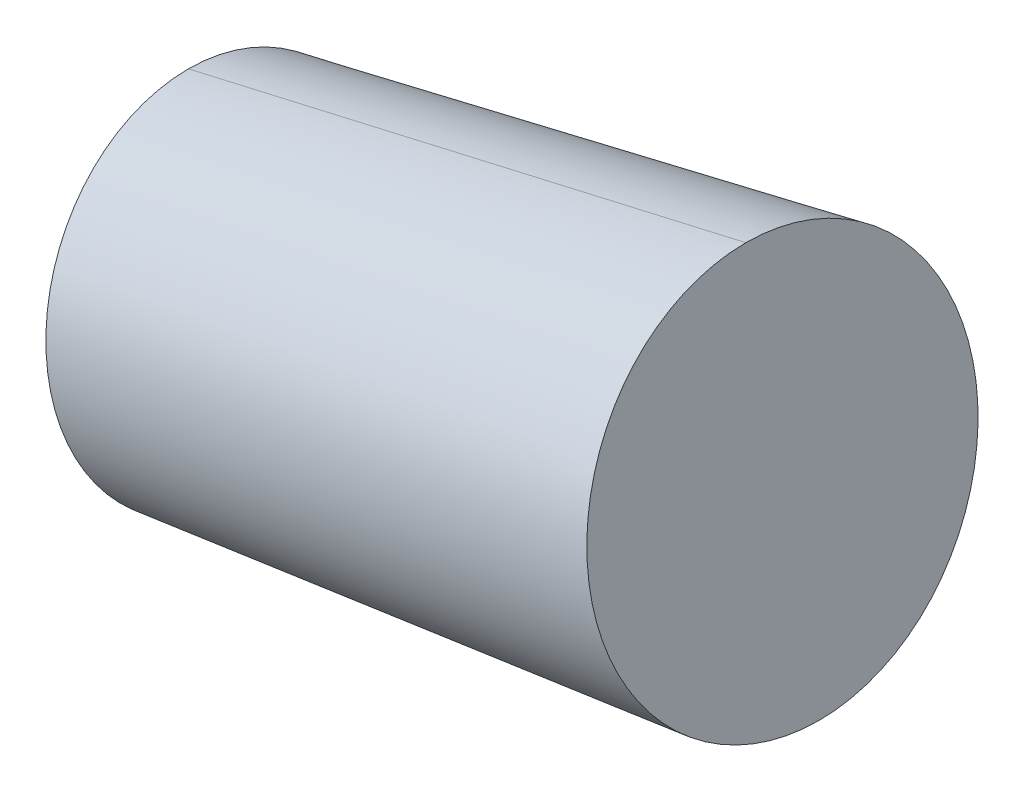
ISO-10303-21;
HEADER;
FILE_DESCRIPTION(('STEP AP214'),'2;1');
FILE_NAME('part.step','',(''),(''),'','','');
FILE_SCHEMA(('AUTOMOTIVE_DESIGN { 1 0 10303 214 1 1 1 1 }'));
ENDSEC;
DATA;
#1=APPLICATION_CONTEXT('core data for automotive mechanical design processes');
#2=APPLICATION_PROTOCOL_DEFINITION('international standard','automotive_design',2000,#1);
#3=PRODUCT_CONTEXT('',#1,'mechanical');
#4=PRODUCT('Part','Part','',(#3));
#5=PRODUCT_RELATED_PRODUCT_CATEGORY('part','',(#4));
#6=PRODUCT_DEFINITION_FORMATION('','',#4);
#7=PRODUCT_DEFINITION_CONTEXT('part definition',#1,'design');
#8=PRODUCT_DEFINITION('design','',#6,#7);
#9=PRODUCT_DEFINITION_SHAPE('','',#8);
#10=(LENGTH_UNIT() NAMED_UNIT(*) SI_UNIT(.MILLI.,.METRE.));
#11=(NAMED_UNIT(*) PLANE_ANGLE_UNIT() SI_UNIT($,.RADIAN.));
#12=(NAMED_UNIT(*) SI_UNIT($,.STERADIAN.) SOLID_ANGLE_UNIT());
#13=UNCERTAINTY_MEASURE_WITH_UNIT(LENGTH_MEASURE(1.E-05),#10,'distance_accuracy_value','');
#14=(GEOMETRIC_REPRESENTATION_CONTEXT(3) GLOBAL_UNCERTAINTY_ASSIGNED_CONTEXT((#13)) GLOBAL_UNIT_ASSIGNED_CONTEXT((#10,
#11,#12)) REPRESENTATION_CONTEXT('',''));
#15=CARTESIAN_POINT('',(0.,0.,0.));
#16=DIRECTION('',(0.,0.,1.));
#17=DIRECTION('',(1.,0.,0.));
#18=AXIS2_PLACEMENT_3D('',#15,#16,#17);
#19=CARTESIAN_POINT('',(11.9525935815063,18.201623689798,0.));
#20=DIRECTION('',(-0.981803266444113,-0.189900884673217,0.));
#21=DIRECTION('',(0.189900884673217,-0.981803266444113,0.));
#22=AXIS2_PLACEMENT_3D('',#19,#20,#21);
#23=PLANE('',#22);
#24=CARTESIAN_POINT('',(11.9525935815066,18.2016236897981,0.));
#25=DIRECTION('',(-0.981803266444113,-0.189900884673217,0.));
#26=DIRECTION('',(0.189900884673217,-0.981803266444113,0.));
#27=AXIS2_PLACEMENT_3D('',#24,#25,#26);
#28=CIRCLE('',#27,3.32229147690943);
#29=CARTESIAN_POINT('',(11.3216874908992,21.4634603139072,0.));
#30=VERTEX_POINT('',#29);
#31=CARTESIAN_POINT('',(12.583499672114,14.939787065689,0.));
#32=VERTEX_POINT('',#31);
#33=EDGE_CURVE('E11',#30,#32,#28,.T.);
#34=ORIENTED_EDGE('',*,*,#33,.F.);
#35=CARTESIAN_POINT('',(11.9525935815066,18.2016236897981,0.));
#36=DIRECTION('',(-0.981803266444113,-0.189900884673217,0.));
#37=DIRECTION('',(0.189900884673217,-0.981803266444113,0.));
#38=AXIS2_PLACEMENT_3D('',#35,#36,#37);
#39=CIRCLE('',#38,3.32229147690943);
#40=EDGE_CURVE('E25',#32,#30,#39,.T.);
#41=ORIENTED_EDGE('',*,*,#40,.F.);
#42=EDGE_LOOP('',(#34,#41));
#43=FACE_BOUND('',#42,.T.);
#44=ADVANCED_FACE('F17',(#43),#23,.F.);
#45=CARTESIAN_POINT('',(11.9525935815066,18.2016236897981,0.));
#46=DIRECTION('',(0.981803266444113,0.189900884673216,0.));
#47=DIRECTION('',(0.,0.,-1.));
#48=AXIS2_PLACEMENT_3D('',#45,#46,#47);
#49=CONICAL_SURFACE('',#48,3.32229147690943,0.0350113047950736);
#50=DIRECTION('',(0.987848904399816,0.155417315882382,0.));
#51=VECTOR('',#50,1.);
#52=CARTESIAN_POINT('',(2.81472025413448,13.402874416571,0.));
#53=LINE('',#52,#51);
#54=CARTESIAN_POINT('',(2.8147202541345,13.402874416571,0.));
#55=VERTEX_POINT('',#54);
#56=EDGE_CURVE('E43',#55,#32,#53,.T.);
#57=ORIENTED_EDGE('',*,*,#56,.T.);
#58=ORIENTED_EDGE('',*,*,#40,.T.);
#59=DIRECTION('',(0.974554265355834,0.224151698357942,0.));
#60=VECTOR('',#59,1.);
#61=CARTESIAN_POINT('',(1.68437797250036,19.246837419787,0.));
#62=LINE('',#61,#60);
#63=CARTESIAN_POINT('',(1.68437797250036,19.246837419787,0.));
#64=VERTEX_POINT('',#63);
#65=EDGE_CURVE('E45',#64,#30,#62,.T.);
#66=ORIENTED_EDGE('',*,*,#65,.F.);
#67=CARTESIAN_POINT('',(2.24954911331744,16.324855918179,0.));
#68=DIRECTION('',(-0.981803266444113,-0.189900884673217,0.));
#69=DIRECTION('',(0.189900884673217,-0.981803266444113,0.));
#70=AXIS2_PLACEMENT_3D('',#67,#68,#69);
#71=CIRCLE('',#70,2.97613748240095);
#72=EDGE_CURVE('E40',#55,#64,#71,.T.);
#73=ORIENTED_EDGE('',*,*,#72,.F.);
#74=EDGE_LOOP('',(#57,#58,#66,#73));
#75=FACE_BOUND('',#74,.T.);
#76=ADVANCED_FACE('F42',(#75),#49,.T.);
#77=CARTESIAN_POINT('',(2.81472025413448,13.402874416571,0.));
#78=DIRECTION('',(0.981803266444113,0.189900884673217,0.));
#79=DIRECTION('',(-0.189900884673217,0.981803266444113,0.));
#80=AXIS2_PLACEMENT_3D('',#77,#78,#79);
#81=PLANE('',#80);
#82=ORIENTED_EDGE('',*,*,#72,.T.);
#83=CARTESIAN_POINT('',(2.24954911331744,16.324855918179,0.));
#84=DIRECTION('',(-0.981803266444113,-0.189900884673217,0.));
#85=DIRECTION('',(0.189900884673217,-0.981803266444113,0.));
#86=AXIS2_PLACEMENT_3D('',#83,#84,#85);
#87=CIRCLE('',#86,2.97613748240095);
#88=EDGE_CURVE('E49',#64,#55,#87,.T.);
#89=ORIENTED_EDGE('',*,*,#88,.T.);
#90=EDGE_LOOP('',(#82,#89));
#91=FACE_BOUND('',#90,.T.);
#92=ADVANCED_FACE('F54',(#91),#81,.F.);
#93=CARTESIAN_POINT('',(11.9525935815066,18.2016236897981,0.));
#94=DIRECTION('',(0.981803266444113,0.189900884673216,0.));
#95=DIRECTION('',(0.,0.,1.));
#96=AXIS2_PLACEMENT_3D('',#93,#94,#95);
#97=CONICAL_SURFACE('',#96,3.32229147690943,0.0350113047950736);
#98=ORIENTED_EDGE('',*,*,#56,.F.);
#99=ORIENTED_EDGE('',*,*,#88,.F.);
#100=ORIENTED_EDGE('',*,*,#65,.T.);
#101=ORIENTED_EDGE('',*,*,#33,.T.);
#102=EDGE_LOOP('',(#98,#99,#100,#101));
#103=FACE_BOUND('',#102,.T.);
#104=ADVANCED_FACE('F52',(#103),#97,.T.);
#105=CLOSED_SHELL('',(#44,#76,#92,#104));
#106=MANIFOLD_SOLID_BREP('B1',#105);
#107=ADVANCED_BREP_SHAPE_REPRESENTATION('',(#18,#106),#14);
#108=SHAPE_DEFINITION_REPRESENTATION(#9,#107);
ENDSEC;
END-ISO-10303-21;
